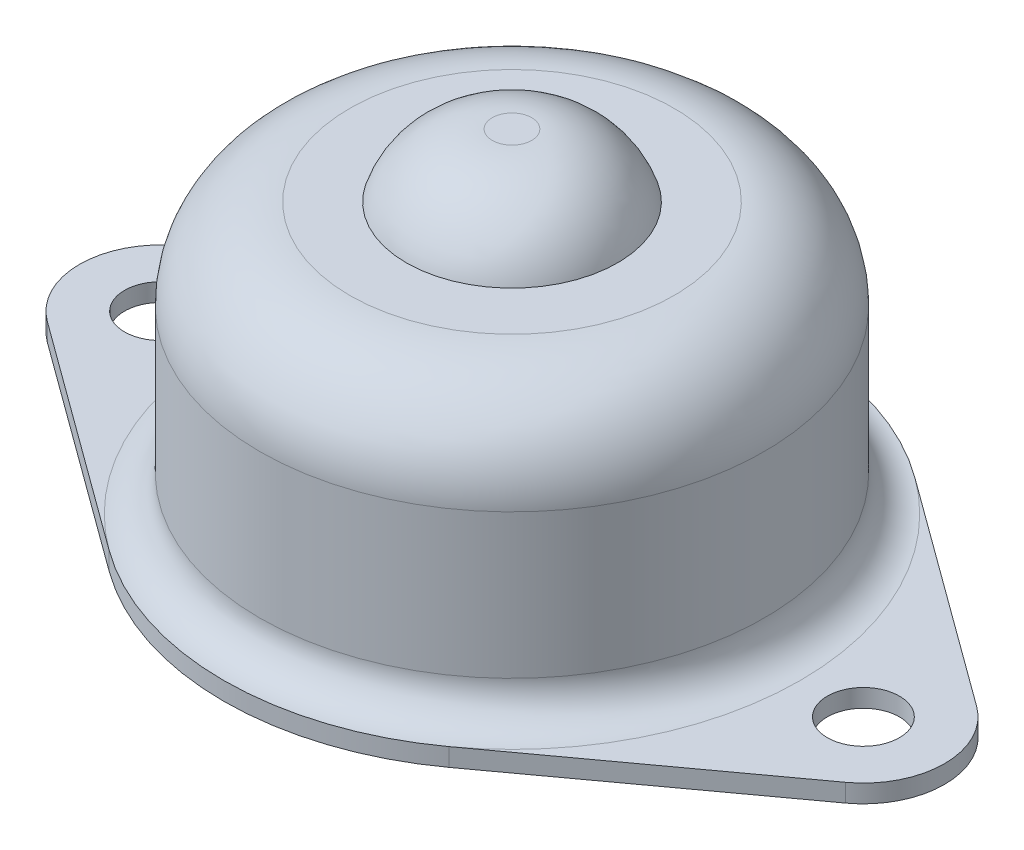
ISO-10303-21;
HEADER;
FILE_DESCRIPTION(('STEP AP214'),'2;1');
FILE_NAME('part.step','',(''),(''),'','','');
FILE_SCHEMA(('AUTOMOTIVE_DESIGN { 1 0 10303 214 1 1 1 1 }'));
ENDSEC;
DATA;
#1=APPLICATION_CONTEXT('core data for automotive mechanical design processes');
#2=APPLICATION_PROTOCOL_DEFINITION('international standard','automotive_design',2000,#1);
#3=PRODUCT_CONTEXT('',#1,'mechanical');
#4=PRODUCT('Part','Part','',(#3));
#5=PRODUCT_RELATED_PRODUCT_CATEGORY('part','',(#4));
#6=PRODUCT_DEFINITION_FORMATION('','',#4);
#7=PRODUCT_DEFINITION_CONTEXT('part definition',#1,'design');
#8=PRODUCT_DEFINITION('design','',#6,#7);
#9=PRODUCT_DEFINITION_SHAPE('','',#8);
#10=(LENGTH_UNIT() NAMED_UNIT(*) SI_UNIT(.MILLI.,.METRE.));
#11=(NAMED_UNIT(*) PLANE_ANGLE_UNIT() SI_UNIT($,.RADIAN.));
#12=(NAMED_UNIT(*) SI_UNIT($,.STERADIAN.) SOLID_ANGLE_UNIT());
#13=UNCERTAINTY_MEASURE_WITH_UNIT(LENGTH_MEASURE(1.E-05),#10,'distance_accuracy_value','');
#14=(GEOMETRIC_REPRESENTATION_CONTEXT(3) GLOBAL_UNCERTAINTY_ASSIGNED_CONTEXT((#13)) GLOBAL_UNIT_ASSIGNED_CONTEXT((#10,
#11,#12)) REPRESENTATION_CONTEXT('',''));
#15=CARTESIAN_POINT('',(0.,0.,0.));
#16=DIRECTION('',(0.,0.,1.));
#17=DIRECTION('',(1.,0.,0.));
#18=AXIS2_PLACEMENT_3D('',#15,#16,#17);
#19=CARTESIAN_POINT('',(-19.5,1.,0.));
#20=DIRECTION('',(0.,1.,0.));
#21=DIRECTION('',(0.,0.,1.));
#22=AXIS2_PLACEMENT_3D('',#19,#20,#21);
#23=PLANE('',#22);
#24=CARTESIAN_POINT('',(-19.5,1.,0.));
#25=DIRECTION('',(0.,1.,0.));
#26=DIRECTION('',(0.,0.,1.));
#27=AXIS2_PLACEMENT_3D('',#24,#25,#26);
#28=CIRCLE('',#27,2.);
#29=CARTESIAN_POINT('',(-19.5,1.,2.00000000000001));
#30=VERTEX_POINT('',#29);
#31=EDGE_CURVE('E191',#30,#30,#28,.T.);
#32=ORIENTED_EDGE('',*,*,#31,.F.);
#33=EDGE_LOOP('',(#32));
#34=FACE_BOUND('',#33,.T.);
#35=DIRECTION('',(0.807590551180699,0.,0.58974358974359));
#36=VECTOR('',#35,1.);
#37=CARTESIAN_POINT('',(-22.1538461538462,1.,3.63415748031314));
#38=LINE('',#37,#36);
#39=CARTESIAN_POINT('',(-22.1538461538462,1.,3.63415748031314));
#40=VERTEX_POINT('',#39);
#41=CARTESIAN_POINT('',(-9.43589743589744,1.,12.9214488188912));
#42=VERTEX_POINT('',#41);
#43=EDGE_CURVE('E95',#40,#42,#38,.T.);
#44=ORIENTED_EDGE('',*,*,#43,.T.);
#45=CARTESIAN_POINT('',(0.,1.,0.));
#46=DIRECTION('',(0.,1.,0.));
#47=DIRECTION('',(0.,0.,1.));
#48=AXIS2_PLACEMENT_3D('',#45,#46,#47);
#49=CIRCLE('',#48,16.);
#50=CARTESIAN_POINT('',(-9.43589743589744,1.,-12.9214488188912));
#51=VERTEX_POINT('',#50);
#52=EDGE_CURVE('E11',#42,#51,#49,.F.);
#53=ORIENTED_EDGE('',*,*,#52,.T.);
#54=DIRECTION('',(-0.807590551180698,0.,0.58974358974359));
#55=VECTOR('',#54,1.);
#56=CARTESIAN_POINT('',(-22.1538461538462,1.,-3.63415748031314));
#57=LINE('',#56,#55);
#58=CARTESIAN_POINT('',(-22.1538461538462,1.,-3.63415748031314));
#59=VERTEX_POINT('',#58);
#60=EDGE_CURVE('E50',#51,#59,#57,.T.);
#61=ORIENTED_EDGE('',*,*,#60,.T.);
#62=CARTESIAN_POINT('',(-19.5,1.,0.));
#63=DIRECTION('',(0.,1.,0.));
#64=DIRECTION('',(0.,0.,1.));
#65=AXIS2_PLACEMENT_3D('',#62,#63,#64);
#66=CIRCLE('',#65,4.5);
#67=EDGE_CURVE('E166',#59,#40,#66,.T.);
#68=ORIENTED_EDGE('',*,*,#67,.T.);
#69=EDGE_LOOP('',(#44,#53,#61,#68));
#70=FACE_BOUND('',#69,.T.);
#71=ADVANCED_FACE('F34',(#34,#70),#23,.T.);
#72=CARTESIAN_POINT('',(19.5,1.,0.));
#73=DIRECTION('',(0.,1.,0.));
#74=DIRECTION('',(0.,0.,1.));
#75=AXIS2_PLACEMENT_3D('',#72,#73,#74);
#76=CIRCLE('',#75,2.);
#77=CARTESIAN_POINT('',(19.5,1.,2.));
#78=VERTEX_POINT('',#77);
#79=EDGE_CURVE('E180',#78,#78,#76,.T.);
#80=ORIENTED_EDGE('',*,*,#79,.F.);
#81=EDGE_LOOP('',(#80));
#82=FACE_BOUND('',#81,.T.);
#83=DIRECTION('',(-0.807590551180699,0.,-0.58974358974359));
#84=VECTOR('',#83,1.);
#85=CARTESIAN_POINT('',(22.1538461538462,1.,-3.63415748031315));
#86=LINE('',#85,#84);
#87=CARTESIAN_POINT('',(22.1538461538462,1.,-3.63415748031315));
#88=VERTEX_POINT('',#87);
#89=CARTESIAN_POINT('',(9.43589743589743,1.,-12.9214488188912));
#90=VERTEX_POINT('',#89);
#91=EDGE_CURVE('E109',#88,#90,#86,.T.);
#92=ORIENTED_EDGE('',*,*,#91,.T.);
#93=CARTESIAN_POINT('',(0.,1.,0.));
#94=DIRECTION('',(0.,1.,0.));
#95=DIRECTION('',(0.,0.,1.));
#96=AXIS2_PLACEMENT_3D('',#93,#94,#95);
#97=CIRCLE('',#96,16.);
#98=CARTESIAN_POINT('',(9.43589743589744,1.,12.9214488188912));
#99=VERTEX_POINT('',#98);
#100=EDGE_CURVE('E43',#90,#99,#97,.F.);
#101=ORIENTED_EDGE('',*,*,#100,.T.);
#102=DIRECTION('',(0.807590551180698,0.,-0.58974358974359));
#103=VECTOR('',#102,1.);
#104=CARTESIAN_POINT('',(22.1538461538462,1.,3.63415748031314));
#105=LINE('',#104,#103);
#106=CARTESIAN_POINT('',(22.1538461538462,1.,3.63415748031314));
#107=VERTEX_POINT('',#106);
#108=EDGE_CURVE('E183',#99,#107,#105,.T.);
#109=ORIENTED_EDGE('',*,*,#108,.T.);
#110=CARTESIAN_POINT('',(19.5,1.,0.));
#111=DIRECTION('',(0.,1.,0.));
#112=DIRECTION('',(0.,0.,1.));
#113=AXIS2_PLACEMENT_3D('',#110,#111,#112);
#114=CIRCLE('',#113,4.5);
#115=EDGE_CURVE('E115',#107,#88,#114,.T.);
#116=ORIENTED_EDGE('',*,*,#115,.T.);
#117=EDGE_LOOP('',(#92,#101,#109,#116));
#118=FACE_BOUND('',#117,.T.);
#119=ADVANCED_FACE('F111',(#82,#118),#23,.T.);
#120=CARTESIAN_POINT('',(-19.5,0.,0.));
#121=DIRECTION('',(0.,1.,0.));
#122=DIRECTION('',(0.,0.,1.));
#123=AXIS2_PLACEMENT_3D('',#120,#121,#122);
#124=PLANE('',#123);
#125=CARTESIAN_POINT('',(-19.5,0.,0.));
#126=DIRECTION('',(0.,1.,0.));
#127=DIRECTION('',(0.,0.,1.));
#128=AXIS2_PLACEMENT_3D('',#125,#126,#127);
#129=CIRCLE('',#128,4.5);
#130=CARTESIAN_POINT('',(-22.1538461538462,0.,-3.63415748031314));
#131=VERTEX_POINT('',#130);
#132=CARTESIAN_POINT('',(-22.1538461538462,0.,3.63415748031314));
#133=VERTEX_POINT('',#132);
#134=EDGE_CURVE('E177',#131,#133,#129,.T.);
#135=ORIENTED_EDGE('',*,*,#134,.F.);
#136=DIRECTION('',(-0.807590551180698,0.,0.58974358974359));
#137=VECTOR('',#136,1.);
#138=CARTESIAN_POINT('',(-22.1538461538462,0.,-3.63415748031314));
#139=LINE('',#138,#137);
#140=CARTESIAN_POINT('',(-9.43589743589744,0.,-12.9214488188912));
#141=VERTEX_POINT('',#140);
#142=EDGE_CURVE('E86',#141,#131,#139,.T.);
#143=ORIENTED_EDGE('',*,*,#142,.F.);
#144=CARTESIAN_POINT('',(0.,0.,0.));
#145=DIRECTION('',(0.,1.,0.));
#146=DIRECTION('',(0.,0.,1.));
#147=AXIS2_PLACEMENT_3D('',#144,#145,#146);
#148=CIRCLE('',#147,16.);
#149=CARTESIAN_POINT('',(9.43589743589743,0.,-12.9214488188912));
#150=VERTEX_POINT('',#149);
#151=EDGE_CURVE('E80',#150,#141,#148,.T.);
#152=ORIENTED_EDGE('',*,*,#151,.F.);
#153=DIRECTION('',(-0.807590551180699,0.,-0.58974358974359));
#154=VECTOR('',#153,1.);
#155=CARTESIAN_POINT('',(22.1538461538462,0.,-3.63415748031315));
#156=LINE('',#155,#154);
#157=CARTESIAN_POINT('',(22.1538461538462,0.,-3.63415748031315));
#158=VERTEX_POINT('',#157);
#159=EDGE_CURVE('E125',#158,#150,#156,.T.);
#160=ORIENTED_EDGE('',*,*,#159,.F.);
#161=CARTESIAN_POINT('',(19.5,0.,0.));
#162=DIRECTION('',(0.,1.,0.));
#163=DIRECTION('',(0.,0.,1.));
#164=AXIS2_PLACEMENT_3D('',#161,#162,#163);
#165=CIRCLE('',#164,4.5);
#166=CARTESIAN_POINT('',(22.1538461538462,0.,3.63415748031314));
#167=VERTEX_POINT('',#166);
#168=EDGE_CURVE('E169',#167,#158,#165,.T.);
#169=ORIENTED_EDGE('',*,*,#168,.F.);
#170=DIRECTION('',(0.807590551180698,0.,-0.58974358974359));
#171=VECTOR('',#170,1.);
#172=CARTESIAN_POINT('',(22.1538461538462,0.,3.63415748031314));
#173=LINE('',#172,#171);
#174=CARTESIAN_POINT('',(9.43589743589744,0.,12.9214488188912));
#175=VERTEX_POINT('',#174);
#176=EDGE_CURVE('E171',#175,#167,#173,.T.);
#177=ORIENTED_EDGE('',*,*,#176,.F.);
#178=CARTESIAN_POINT('',(0.,0.,0.));
#179=DIRECTION('',(0.,1.,0.));
#180=DIRECTION('',(0.,0.,1.));
#181=AXIS2_PLACEMENT_3D('',#178,#179,#180);
#182=CIRCLE('',#181,16.);
#183=CARTESIAN_POINT('',(-9.43589743589744,0.,12.9214488188912));
#184=VERTEX_POINT('',#183);
#185=EDGE_CURVE('E173',#184,#175,#182,.T.);
#186=ORIENTED_EDGE('',*,*,#185,.F.);
#187=DIRECTION('',(0.807590551180699,0.,0.58974358974359));
#188=VECTOR('',#187,1.);
#189=CARTESIAN_POINT('',(-22.1538461538462,0.,3.63415748031314));
#190=LINE('',#189,#188);
#191=EDGE_CURVE('E175',#133,#184,#190,.T.);
#192=ORIENTED_EDGE('',*,*,#191,.F.);
#193=EDGE_LOOP('',(#135,#143,#152,#160,#169,#177,#186,#192));
#194=FACE_BOUND('',#193,.T.);
#195=CARTESIAN_POINT('',(19.5,0.,0.));
#196=DIRECTION('',(0.,1.,0.));
#197=DIRECTION('',(0.,0.,1.));
#198=AXIS2_PLACEMENT_3D('',#195,#196,#197);
#199=CIRCLE('',#198,2.);
#200=CARTESIAN_POINT('',(19.5,0.,2.));
#201=VERTEX_POINT('',#200);
#202=EDGE_CURVE('E188',#201,#201,#199,.T.);
#203=ORIENTED_EDGE('',*,*,#202,.T.);
#204=EDGE_LOOP('',(#203));
#205=FACE_BOUND('',#204,.T.);
#206=CARTESIAN_POINT('',(-19.5,0.,0.));
#207=DIRECTION('',(0.,1.,0.));
#208=DIRECTION('',(0.,0.,1.));
#209=AXIS2_PLACEMENT_3D('',#206,#207,#208);
#210=CIRCLE('',#209,2.);
#211=CARTESIAN_POINT('',(-19.5,0.,2.00000000000001));
#212=VERTEX_POINT('',#211);
#213=EDGE_CURVE('E194',#212,#212,#210,.T.);
#214=ORIENTED_EDGE('',*,*,#213,.T.);
#215=EDGE_LOOP('',(#214));
#216=FACE_BOUND('',#215,.T.);
#217=ADVANCED_FACE('F232',(#194,#205,#216),#124,.F.);
#218=CARTESIAN_POINT('',(-19.5,1.,0.));
#219=DIRECTION('',(0.,-1.,0.));
#220=DIRECTION('',(0.,0.,-1.));
#221=AXIS2_PLACEMENT_3D('',#218,#219,#220);
#222=CYLINDRICAL_SURFACE('',#221,4.5);
#223=ORIENTED_EDGE('',*,*,#134,.T.);
#224=DIRECTION('',(0.,-1.,0.));
#225=VECTOR('',#224,1.);
#226=CARTESIAN_POINT('',(-22.1538461538462,1.,3.63415748031314));
#227=LINE('',#226,#225);
#228=EDGE_CURVE('E150',#40,#133,#227,.T.);
#229=ORIENTED_EDGE('',*,*,#228,.F.);
#230=ORIENTED_EDGE('',*,*,#67,.F.);
#231=DIRECTION('',(0.,-1.,0.));
#232=VECTOR('',#231,1.);
#233=CARTESIAN_POINT('',(-22.1538461538462,1.,-3.63415748031314));
#234=LINE('',#233,#232);
#235=EDGE_CURVE('E163',#59,#131,#234,.T.);
#236=ORIENTED_EDGE('',*,*,#235,.T.);
#237=EDGE_LOOP('',(#223,#229,#230,#236));
#238=FACE_BOUND('',#237,.T.);
#239=ADVANCED_FACE('F241',(#238),#222,.T.);
#240=CARTESIAN_POINT('',(-22.1538461538462,1.,3.63415748031314));
#241=DIRECTION('',(0.58974358974359,0.,-0.807590551180699));
#242=DIRECTION('',(-0.807590551180699,0.,-0.58974358974359));
#243=AXIS2_PLACEMENT_3D('',#240,#241,#242);
#244=PLANE('',#243);
#245=ORIENTED_EDGE('',*,*,#191,.T.);
#246=DIRECTION('',(0.,-1.,0.));
#247=VECTOR('',#246,1.);
#248=CARTESIAN_POINT('',(-9.43589743589744,1.,12.9214488188912));
#249=LINE('',#248,#247);
#250=EDGE_CURVE('E152',#42,#184,#249,.T.);
#251=ORIENTED_EDGE('',*,*,#250,.F.);
#252=ORIENTED_EDGE('',*,*,#43,.F.);
#253=ORIENTED_EDGE('',*,*,#228,.T.);
#254=EDGE_LOOP('',(#245,#251,#252,#253));
#255=FACE_BOUND('',#254,.T.);
#256=ADVANCED_FACE('F261',(#255),#244,.F.);
#257=CARTESIAN_POINT('',(0.,1.,0.));
#258=DIRECTION('',(0.,-1.,0.));
#259=DIRECTION('',(0.,0.,-1.));
#260=AXIS2_PLACEMENT_3D('',#257,#258,#259);
#261=CYLINDRICAL_SURFACE('',#260,16.);
#262=ORIENTED_EDGE('',*,*,#185,.T.);
#263=DIRECTION('',(0.,-1.,0.));
#264=VECTOR('',#263,1.);
#265=CARTESIAN_POINT('',(9.43589743589744,1.,12.9214488188912));
#266=LINE('',#265,#264);
#267=EDGE_CURVE('E155',#99,#175,#266,.T.);
#268=ORIENTED_EDGE('',*,*,#267,.F.);
#269=CARTESIAN_POINT('',(0.,1.,0.));
#270=DIRECTION('',(0.,1.,0.));
#271=DIRECTION('',(0.,0.,1.));
#272=AXIS2_PLACEMENT_3D('',#269,#270,#271);
#273=CIRCLE('',#272,16.);
#274=EDGE_CURVE('E136',#42,#99,#273,.T.);
#275=ORIENTED_EDGE('',*,*,#274,.F.);
#276=ORIENTED_EDGE('',*,*,#250,.T.);
#277=EDGE_LOOP('',(#262,#268,#275,#276));
#278=FACE_BOUND('',#277,.T.);
#279=ADVANCED_FACE('F257',(#278),#261,.T.);
#280=CARTESIAN_POINT('',(22.1538461538462,1.,3.63415748031314));
#281=DIRECTION('',(-0.58974358974359,0.,-0.807590551180698));
#282=DIRECTION('',(-0.807590551180698,0.,0.58974358974359));
#283=AXIS2_PLACEMENT_3D('',#280,#281,#282);
#284=PLANE('',#283);
#285=ORIENTED_EDGE('',*,*,#176,.T.);
#286=DIRECTION('',(0.,-1.,0.));
#287=VECTOR('',#286,1.);
#288=CARTESIAN_POINT('',(22.1538461538462,1.,3.63415748031314));
#289=LINE('',#288,#287);
#290=EDGE_CURVE('E158',#107,#167,#289,.T.);
#291=ORIENTED_EDGE('',*,*,#290,.F.);
#292=ORIENTED_EDGE('',*,*,#108,.F.);
#293=ORIENTED_EDGE('',*,*,#267,.T.);
#294=EDGE_LOOP('',(#285,#291,#292,#293));
#295=FACE_BOUND('',#294,.T.);
#296=ADVANCED_FACE('F253',(#295),#284,.F.);
#297=CARTESIAN_POINT('',(19.5,1.,0.));
#298=DIRECTION('',(0.,-1.,0.));
#299=DIRECTION('',(0.,0.,-1.));
#300=AXIS2_PLACEMENT_3D('',#297,#298,#299);
#301=CYLINDRICAL_SURFACE('',#300,4.5);
#302=ORIENTED_EDGE('',*,*,#168,.T.);
#303=DIRECTION('',(0.,-1.,0.));
#304=VECTOR('',#303,1.);
#305=CARTESIAN_POINT('',(22.1538461538462,1.,-3.63415748031315));
#306=LINE('',#305,#304);
#307=EDGE_CURVE('E126',#88,#158,#306,.T.);
#308=ORIENTED_EDGE('',*,*,#307,.F.);
#309=ORIENTED_EDGE('',*,*,#115,.F.);
#310=ORIENTED_EDGE('',*,*,#290,.T.);
#311=EDGE_LOOP('',(#302,#308,#309,#310));
#312=FACE_BOUND('',#311,.T.);
#313=ADVANCED_FACE('F250',(#312),#301,.T.);
#314=CARTESIAN_POINT('',(22.1538461538462,1.,-3.63415748031315));
#315=DIRECTION('',(-0.58974358974359,0.,0.807590551180699));
#316=DIRECTION('',(0.807590551180699,0.,0.58974358974359));
#317=AXIS2_PLACEMENT_3D('',#314,#315,#316);
#318=PLANE('',#317);
#319=ORIENTED_EDGE('',*,*,#159,.T.);
#320=DIRECTION('',(0.,-1.,0.));
#321=VECTOR('',#320,1.);
#322=CARTESIAN_POINT('',(9.43589743589743,1.,-12.9214488188912));
#323=LINE('',#322,#321);
#324=EDGE_CURVE('E121',#90,#150,#323,.T.);
#325=ORIENTED_EDGE('',*,*,#324,.F.);
#326=ORIENTED_EDGE('',*,*,#91,.F.);
#327=ORIENTED_EDGE('',*,*,#307,.T.);
#328=EDGE_LOOP('',(#319,#325,#326,#327));
#329=FACE_BOUND('',#328,.T.);
#330=ADVANCED_FACE('F123',(#329),#318,.F.);
#331=CARTESIAN_POINT('',(0.,1.,0.));
#332=DIRECTION('',(0.,-1.,0.));
#333=DIRECTION('',(0.,0.,-1.));
#334=AXIS2_PLACEMENT_3D('',#331,#332,#333);
#335=CYLINDRICAL_SURFACE('',#334,16.);
#336=ORIENTED_EDGE('',*,*,#151,.T.);
#337=DIRECTION('',(0.,-1.,0.));
#338=VECTOR('',#337,1.);
#339=CARTESIAN_POINT('',(-9.43589743589744,1.,-12.9214488188912));
#340=LINE('',#339,#338);
#341=EDGE_CURVE('E127',#51,#141,#340,.T.);
#342=ORIENTED_EDGE('',*,*,#341,.F.);
#343=CARTESIAN_POINT('',(0.,1.,0.));
#344=DIRECTION('',(0.,1.,0.));
#345=DIRECTION('',(0.,0.,1.));
#346=AXIS2_PLACEMENT_3D('',#343,#344,#345);
#347=CIRCLE('',#346,16.);
#348=EDGE_CURVE('E119',#90,#51,#347,.T.);
#349=ORIENTED_EDGE('',*,*,#348,.F.);
#350=ORIENTED_EDGE('',*,*,#324,.T.);
#351=EDGE_LOOP('',(#336,#342,#349,#350));
#352=FACE_BOUND('',#351,.T.);
#353=ADVANCED_FACE('F129',(#352),#335,.T.);
#354=CARTESIAN_POINT('',(-22.1538461538462,1.,-3.63415748031314));
#355=DIRECTION('',(0.58974358974359,0.,0.807590551180698));
#356=DIRECTION('',(0.807590551180698,0.,-0.58974358974359));
#357=AXIS2_PLACEMENT_3D('',#354,#355,#356);
#358=PLANE('',#357);
#359=ORIENTED_EDGE('',*,*,#142,.T.);
#360=ORIENTED_EDGE('',*,*,#235,.F.);
#361=ORIENTED_EDGE('',*,*,#60,.F.);
#362=ORIENTED_EDGE('',*,*,#341,.T.);
#363=EDGE_LOOP('',(#359,#360,#361,#362));
#364=FACE_BOUND('',#363,.T.);
#365=ADVANCED_FACE('F243',(#364),#358,.F.);
#366=CARTESIAN_POINT('',(19.5,1.,0.));
#367=DIRECTION('',(0.,-1.,0.));
#368=DIRECTION('',(0.,0.,-1.));
#369=AXIS2_PLACEMENT_3D('',#366,#367,#368);
#370=CYLINDRICAL_SURFACE('',#369,2.);
#371=ORIENTED_EDGE('',*,*,#79,.T.);
#372=EDGE_LOOP('',(#371));
#373=FACE_BOUND('',#372,.T.);
#374=ORIENTED_EDGE('',*,*,#202,.F.);
#375=EDGE_LOOP('',(#374));
#376=FACE_BOUND('',#375,.T.);
#377=ADVANCED_FACE('F237',(#373,#376),#370,.F.);
#378=CARTESIAN_POINT('',(-19.5,1.,0.));
#379=DIRECTION('',(0.,-1.,0.));
#380=DIRECTION('',(0.,0.,-1.));
#381=AXIS2_PLACEMENT_3D('',#378,#379,#380);
#382=CYLINDRICAL_SURFACE('',#381,2.);
#383=ORIENTED_EDGE('',*,*,#31,.T.);
#384=EDGE_LOOP('',(#383));
#385=FACE_BOUND('',#384,.T.);
#386=ORIENTED_EDGE('',*,*,#213,.F.);
#387=EDGE_LOOP('',(#386));
#388=FACE_BOUND('',#387,.T.);
#389=ADVANCED_FACE('F282',(#385,#388),#382,.F.);
#390=CARTESIAN_POINT('',(0.,16.,0.));
#391=DIRECTION('',(0.,-1.,0.));
#392=DIRECTION('',(0.,0.,-1.));
#393=AXIS2_PLACEMENT_3D('',#390,#391,#392);
#394=CYLINDRICAL_SURFACE('',#393,14.);
#395=CARTESIAN_POINT('',(0.,3.,0.));
#396=DIRECTION('',(0.,1.,0.));
#397=DIRECTION('',(0.,0.,1.));
#398=AXIS2_PLACEMENT_3D('',#395,#396,#397);
#399=CIRCLE('',#398,14.);
#400=CARTESIAN_POINT('',(0.,3.,14.));
#401=VERTEX_POINT('',#400);
#402=EDGE_CURVE('E137',#401,#401,#399,.T.);
#403=ORIENTED_EDGE('',*,*,#402,.T.);
#404=EDGE_LOOP('',(#403));
#405=FACE_BOUND('',#404,.T.);
#406=CARTESIAN_POINT('',(0.,11.,0.));
#407=DIRECTION('',(0.,1.,0.));
#408=DIRECTION('',(0.,0.,1.));
#409=AXIS2_PLACEMENT_3D('',#406,#407,#408);
#410=CIRCLE('',#409,14.);
#411=CARTESIAN_POINT('',(0.,11.,14.));
#412=VERTEX_POINT('',#411);
#413=EDGE_CURVE('E144',#412,#412,#410,.F.);
#414=ORIENTED_EDGE('',*,*,#413,.T.);
#415=EDGE_LOOP('',(#414));
#416=FACE_BOUND('',#415,.T.);
#417=ADVANCED_FACE('F210',(#405,#416),#394,.T.);
#418=CARTESIAN_POINT('',(0.,16.,0.));
#419=DIRECTION('',(0.,1.,0.));
#420=DIRECTION('',(0.,0.,1.));
#421=AXIS2_PLACEMENT_3D('',#418,#419,#420);
#422=PLANE('',#421);
#423=CARTESIAN_POINT('',(0.,16.,0.));
#424=DIRECTION('',(0.,1.,0.));
#425=DIRECTION('',(0.,0.,1.));
#426=AXIS2_PLACEMENT_3D('',#423,#424,#425);
#427=CIRCLE('',#426,5.86352280799848);
#428=CARTESIAN_POINT('',(0.,16.,5.86352280799848));
#429=VERTEX_POINT('',#428);
#430=EDGE_CURVE('E197',#429,#429,#427,.T.);
#431=ORIENTED_EDGE('',*,*,#430,.F.);
#432=EDGE_LOOP('',(#431));
#433=FACE_BOUND('',#432,.T.);
#434=CARTESIAN_POINT('',(0.,16.,0.));
#435=DIRECTION('',(0.,1.,0.));
#436=DIRECTION('',(0.,0.,1.));
#437=AXIS2_PLACEMENT_3D('',#434,#435,#436);
#438=CIRCLE('',#437,9.);
#439=CARTESIAN_POINT('',(0.,16.,9.));
#440=VERTEX_POINT('',#439);
#441=EDGE_CURVE('E147',#440,#440,#438,.T.);
#442=ORIENTED_EDGE('',*,*,#441,.T.);
#443=EDGE_LOOP('',(#442));
#444=FACE_BOUND('',#443,.T.);
#445=ADVANCED_FACE('F206',(#433,#444),#422,.T.);
#446=CARTESIAN_POINT('',(0.,11.,0.));
#447=DIRECTION('',(0.,1.,0.));
#448=DIRECTION('',(0.,0.,1.));
#449=AXIS2_PLACEMENT_3D('',#446,#447,#448);
#450=TOROIDAL_SURFACE('',#449,9.,5.);
#451=ORIENTED_EDGE('',*,*,#413,.F.);
#452=EDGE_LOOP('',(#451));
#453=FACE_BOUND('',#452,.T.);
#454=ORIENTED_EDGE('',*,*,#441,.F.);
#455=EDGE_LOOP('',(#454));
#456=FACE_BOUND('',#455,.T.);
#457=ADVANCED_FACE('F209',(#453,#456),#450,.T.);
#458=CARTESIAN_POINT('',(0.,19.5,0.));
#459=DIRECTION('',(0.,1.,0.));
#460=DIRECTION('',(0.,0.,1.));
#461=AXIS2_PLACEMENT_3D('',#458,#459,#460);
#462=PLANE('',#461);
#463=CARTESIAN_POINT('',(0.,19.5,0.));
#464=DIRECTION('',(0.,1.,0.));
#465=DIRECTION('',(0.,0.,1.));
#466=AXIS2_PLACEMENT_3D('',#463,#464,#465);
#467=CIRCLE('',#466,1.09382680091375);
#468=CARTESIAN_POINT('',(0.,19.5,1.09382680091375));
#469=VERTEX_POINT('',#468);
#470=EDGE_CURVE('E139',#469,#469,#467,.T.);
#471=ORIENTED_EDGE('',*,*,#470,.T.);
#472=EDGE_LOOP('',(#471));
#473=FACE_BOUND('',#472,.T.);
#474=ADVANCED_FACE('F215',(#473),#462,.T.);
#475=CARTESIAN_POINT('',(0.,14.5,0.));
#476=DIRECTION('',(0.,-1.,0.));
#477=DIRECTION('',(0.,0.,-1.));
#478=AXIS2_PLACEMENT_3D('',#475,#476,#477);
#479=DEGENERATE_TOROIDAL_SURFACE('',#478,1.09382680091375,5.,.T.);
#480=ORIENTED_EDGE('',*,*,#430,.T.);
#481=EDGE_LOOP('',(#480));
#482=FACE_BOUND('',#481,.T.);
#483=ORIENTED_EDGE('',*,*,#470,.F.);
#484=EDGE_LOOP('',(#483));
#485=FACE_BOUND('',#484,.T.);
#486=ADVANCED_FACE('F203',(#482,#485),#479,.T.);
#487=CARTESIAN_POINT('',(0.,3.,0.));
#488=DIRECTION('',(0.,1.,0.));
#489=DIRECTION('',(0.,0.,1.));
#490=AXIS2_PLACEMENT_3D('',#487,#488,#489);
#491=TOROIDAL_SURFACE('',#490,16.,2.);
#492=ORIENTED_EDGE('',*,*,#348,.T.);
#493=ORIENTED_EDGE('',*,*,#52,.F.);
#494=ORIENTED_EDGE('',*,*,#274,.T.);
#495=ORIENTED_EDGE('',*,*,#100,.F.);
#496=EDGE_LOOP('',(#492,#493,#494,#495));
#497=FACE_BOUND('',#496,.T.);
#498=ORIENTED_EDGE('',*,*,#402,.F.);
#499=EDGE_LOOP('',(#498));
#500=FACE_BOUND('',#499,.T.);
#501=ADVANCED_FACE('F36',(#497,#500),#491,.F.);
#502=CLOSED_SHELL('',(#71,#119,#217,#239,#256,#279,#296,#313,#330,#353,#365,#377,#389,#417,#445,
#457,#474,#486,#501));
#503=MANIFOLD_SOLID_BREP('B2',#502);
#504=ADVANCED_BREP_SHAPE_REPRESENTATION('',(#18,#503),#14);
#505=SHAPE_DEFINITION_REPRESENTATION(#9,#504);
ENDSEC;
END-ISO-10303-21;
